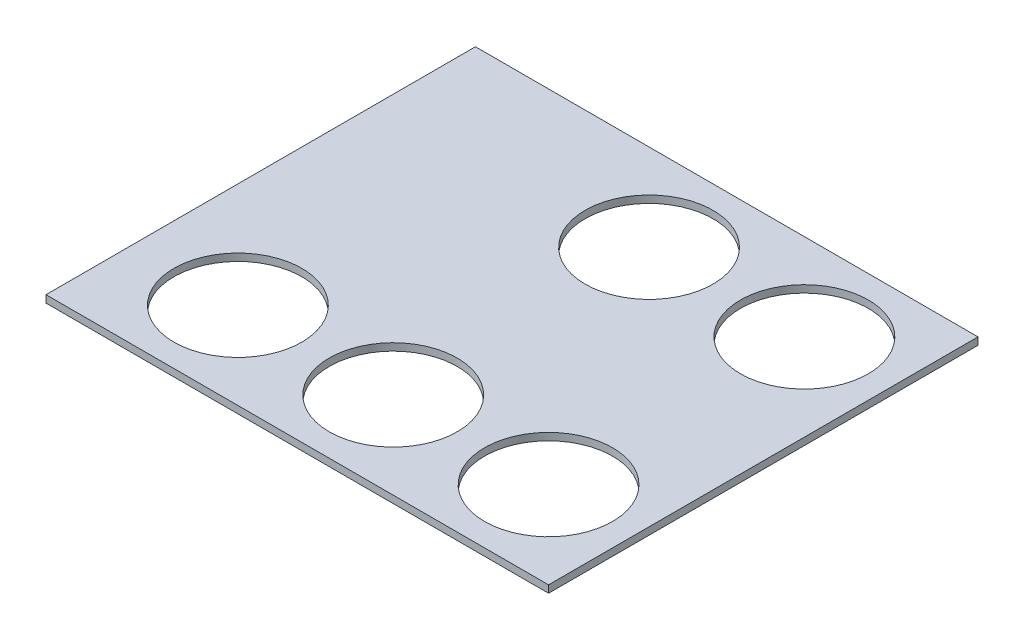
ISO-10303-21;
HEADER;
FILE_DESCRIPTION(('STEP AP214'),'2;1');
FILE_NAME('part.step','',(''),(''),'','','');
FILE_SCHEMA(('AUTOMOTIVE_DESIGN { 1 0 10303 214 1 1 1 1 }'));
ENDSEC;
DATA;
#1=APPLICATION_CONTEXT('core data for automotive mechanical design processes');
#2=APPLICATION_PROTOCOL_DEFINITION('international standard','automotive_design',2000,#1);
#3=PRODUCT_CONTEXT('',#1,'mechanical');
#4=PRODUCT('Part','Part','',(#3));
#5=PRODUCT_RELATED_PRODUCT_CATEGORY('part','',(#4));
#6=PRODUCT_DEFINITION_FORMATION('','',#4);
#7=PRODUCT_DEFINITION_CONTEXT('part definition',#1,'design');
#8=PRODUCT_DEFINITION('design','',#6,#7);
#9=PRODUCT_DEFINITION_SHAPE('','',#8);
#10=(LENGTH_UNIT() NAMED_UNIT(*) SI_UNIT(.MILLI.,.METRE.));
#11=(NAMED_UNIT(*) PLANE_ANGLE_UNIT() SI_UNIT($,.RADIAN.));
#12=(NAMED_UNIT(*) SI_UNIT($,.STERADIAN.) SOLID_ANGLE_UNIT());
#13=UNCERTAINTY_MEASURE_WITH_UNIT(LENGTH_MEASURE(1.E-05),#10,'distance_accuracy_value','');
#14=(GEOMETRIC_REPRESENTATION_CONTEXT(3) GLOBAL_UNCERTAINTY_ASSIGNED_CONTEXT((#13)) GLOBAL_UNIT_ASSIGNED_CONTEXT((#10,
#11,#12)) REPRESENTATION_CONTEXT('',''));
#15=CARTESIAN_POINT('',(0.,0.,0.));
#16=DIRECTION('',(0.,0.,1.));
#17=DIRECTION('',(1.,0.,0.));
#18=AXIS2_PLACEMENT_3D('',#15,#16,#17);
#19=CARTESIAN_POINT('',(0.,8.,0.));
#20=DIRECTION('',(1.,0.,0.));
#21=DIRECTION('',(0.,0.,-1.));
#22=AXIS2_PLACEMENT_3D('',#19,#20,#21);
#23=PLANE('',#22);
#24=DIRECTION('',(0.,0.,1.));
#25=VECTOR('',#24,1.);
#26=CARTESIAN_POINT('',(0.,0.,0.));
#27=LINE('',#26,#25);
#28=CARTESIAN_POINT('',(0.,0.,-470.));
#29=VERTEX_POINT('',#28);
#30=CARTESIAN_POINT('',(0.,0.,0.));
#31=VERTEX_POINT('',#30);
#32=EDGE_CURVE('E107',#29,#31,#27,.T.);
#33=ORIENTED_EDGE('',*,*,#32,.T.);
#34=DIRECTION('',(0.,-1.,0.));
#35=VECTOR('',#34,1.);
#36=CARTESIAN_POINT('',(0.,8.,0.));
#37=LINE('',#36,#35);
#38=CARTESIAN_POINT('',(0.,8.,0.));
#39=VERTEX_POINT('',#38);
#40=EDGE_CURVE('E11',#39,#31,#37,.T.);
#41=ORIENTED_EDGE('',*,*,#40,.F.);
#42=DIRECTION('',(0.,0.,1.));
#43=VECTOR('',#42,1.);
#44=CARTESIAN_POINT('',(0.,8.,0.));
#45=LINE('',#44,#43);
#46=CARTESIAN_POINT('',(0.,8.,-470.));
#47=VERTEX_POINT('',#46);
#48=EDGE_CURVE('E92',#47,#39,#45,.T.);
#49=ORIENTED_EDGE('',*,*,#48,.F.);
#50=DIRECTION('',(0.,-1.,0.));
#51=VECTOR('',#50,1.);
#52=CARTESIAN_POINT('',(0.,8.,-470.));
#53=LINE('',#52,#51);
#54=EDGE_CURVE('E103',#47,#29,#53,.T.);
#55=ORIENTED_EDGE('',*,*,#54,.T.);
#56=EDGE_LOOP('',(#33,#41,#49,#55));
#57=FACE_BOUND('',#56,.T.);
#58=ADVANCED_FACE('F38',(#57),#23,.F.);
#59=CARTESIAN_POINT('',(0.,8.,0.));
#60=DIRECTION('',(0.,0.,-1.));
#61=DIRECTION('',(-1.,0.,0.));
#62=AXIS2_PLACEMENT_3D('',#59,#60,#61);
#63=PLANE('',#62);
#64=DIRECTION('',(1.,0.,0.));
#65=VECTOR('',#64,1.);
#66=CARTESIAN_POINT('',(0.,0.,0.));
#67=LINE('',#66,#65);
#68=CARTESIAN_POINT('',(550.,0.,0.));
#69=VERTEX_POINT('',#68);
#70=EDGE_CURVE('E97',#31,#69,#67,.T.);
#71=ORIENTED_EDGE('',*,*,#70,.T.);
#72=DIRECTION('',(0.,-1.,0.));
#73=VECTOR('',#72,1.);
#74=CARTESIAN_POINT('',(550.,8.,0.));
#75=LINE('',#74,#73);
#76=CARTESIAN_POINT('',(550.,8.,0.));
#77=VERTEX_POINT('',#76);
#78=EDGE_CURVE('E47',#77,#69,#75,.T.);
#79=ORIENTED_EDGE('',*,*,#78,.F.);
#80=DIRECTION('',(1.,0.,0.));
#81=VECTOR('',#80,1.);
#82=CARTESIAN_POINT('',(0.,8.,0.));
#83=LINE('',#82,#81);
#84=EDGE_CURVE('E87',#39,#77,#83,.T.);
#85=ORIENTED_EDGE('',*,*,#84,.F.);
#86=ORIENTED_EDGE('',*,*,#40,.T.);
#87=EDGE_LOOP('',(#71,#79,#85,#86));
#88=FACE_BOUND('',#87,.T.);
#89=ADVANCED_FACE('F96',(#88),#63,.F.);
#90=CARTESIAN_POINT('',(550.,8.,0.));
#91=DIRECTION('',(-1.,0.,0.));
#92=DIRECTION('',(0.,0.,1.));
#93=AXIS2_PLACEMENT_3D('',#90,#91,#92);
#94=PLANE('',#93);
#95=DIRECTION('',(0.,0.,-1.));
#96=VECTOR('',#95,1.);
#97=CARTESIAN_POINT('',(550.,0.,0.));
#98=LINE('',#97,#96);
#99=CARTESIAN_POINT('',(550.,0.,-470.));
#100=VERTEX_POINT('',#99);
#101=EDGE_CURVE('E73',#69,#100,#98,.T.);
#102=ORIENTED_EDGE('',*,*,#101,.T.);
#103=DIRECTION('',(0.,-1.,0.));
#104=VECTOR('',#103,1.);
#105=CARTESIAN_POINT('',(550.,8.,-470.));
#106=LINE('',#105,#104);
#107=CARTESIAN_POINT('',(550.,8.,-470.));
#108=VERTEX_POINT('',#107);
#109=EDGE_CURVE('E98',#108,#100,#106,.T.);
#110=ORIENTED_EDGE('',*,*,#109,.F.);
#111=DIRECTION('',(0.,0.,-1.));
#112=VECTOR('',#111,1.);
#113=CARTESIAN_POINT('',(550.,8.,0.));
#114=LINE('',#113,#112);
#115=EDGE_CURVE('E90',#77,#108,#114,.T.);
#116=ORIENTED_EDGE('',*,*,#115,.F.);
#117=ORIENTED_EDGE('',*,*,#78,.T.);
#118=EDGE_LOOP('',(#102,#110,#116,#117));
#119=FACE_BOUND('',#118,.T.);
#120=ADVANCED_FACE('F99',(#119),#94,.F.);
#121=CARTESIAN_POINT('',(0.,8.,-470.));
#122=DIRECTION('',(0.,0.,1.));
#123=DIRECTION('',(1.,0.,0.));
#124=AXIS2_PLACEMENT_3D('',#121,#122,#123);
#125=PLANE('',#124);
#126=DIRECTION('',(-1.,0.,0.));
#127=VECTOR('',#126,1.);
#128=CARTESIAN_POINT('',(0.,0.,-470.));
#129=LINE('',#128,#127);
#130=EDGE_CURVE('E79',#100,#29,#129,.T.);
#131=ORIENTED_EDGE('',*,*,#130,.T.);
#132=ORIENTED_EDGE('',*,*,#54,.F.);
#133=DIRECTION('',(-1.,0.,0.));
#134=VECTOR('',#133,1.);
#135=CARTESIAN_POINT('',(0.,8.,-470.));
#136=LINE('',#135,#134);
#137=EDGE_CURVE('E55',#108,#47,#136,.T.);
#138=ORIENTED_EDGE('',*,*,#137,.F.);
#139=ORIENTED_EDGE('',*,*,#109,.T.);
#140=EDGE_LOOP('',(#131,#132,#138,#139));
#141=FACE_BOUND('',#140,.T.);
#142=ADVANCED_FACE('F117',(#141),#125,.F.);
#143=CARTESIAN_POINT('',(0.,8.,0.));
#144=DIRECTION('',(0.,-1.,0.));
#145=DIRECTION('',(0.,0.,-1.));
#146=AXIS2_PLACEMENT_3D('',#143,#144,#145);
#147=PLANE('',#146);
#148=CARTESIAN_POINT('',(285.,8.,-375.));
#149=DIRECTION('',(0.,1.,0.));
#150=DIRECTION('',(0.,0.,1.));
#151=AXIS2_PLACEMENT_3D('',#148,#149,#150);
#152=CIRCLE('',#151,70.);
#153=CARTESIAN_POINT('',(285.,8.,-305.));
#154=VERTEX_POINT('',#153);
#155=EDGE_CURVE('E137',#154,#154,#152,.T.);
#156=ORIENTED_EDGE('',*,*,#155,.F.);
#157=EDGE_LOOP('',(#156));
#158=FACE_BOUND('',#157,.T.);
#159=CARTESIAN_POINT('',(455.,8.,-375.));
#160=DIRECTION('',(0.,1.,0.));
#161=DIRECTION('',(0.,0.,1.));
#162=AXIS2_PLACEMENT_3D('',#159,#160,#161);
#163=CIRCLE('',#162,70.0000000000001);
#164=CARTESIAN_POINT('',(455.,8.,-305.));
#165=VERTEX_POINT('',#164);
#166=EDGE_CURVE('E145',#165,#165,#163,.T.);
#167=ORIENTED_EDGE('',*,*,#166,.F.);
#168=EDGE_LOOP('',(#167));
#169=FACE_BOUND('',#168,.T.);
#170=CARTESIAN_POINT('',(115.,8.,-95.));
#171=DIRECTION('',(0.,1.,0.));
#172=DIRECTION('',(0.,0.,1.));
#173=AXIS2_PLACEMENT_3D('',#170,#171,#172);
#174=CIRCLE('',#173,70.);
#175=CARTESIAN_POINT('',(115.,8.,-25.));
#176=VERTEX_POINT('',#175);
#177=EDGE_CURVE('E153',#176,#176,#174,.T.);
#178=ORIENTED_EDGE('',*,*,#177,.F.);
#179=EDGE_LOOP('',(#178));
#180=FACE_BOUND('',#179,.T.);
#181=CARTESIAN_POINT('',(285.,8.,-95.));
#182=DIRECTION('',(0.,1.,0.));
#183=DIRECTION('',(0.,0.,1.));
#184=AXIS2_PLACEMENT_3D('',#181,#182,#183);
#185=CIRCLE('',#184,70.);
#186=CARTESIAN_POINT('',(285.,8.,-25.));
#187=VERTEX_POINT('',#186);
#188=EDGE_CURVE('E129',#187,#187,#185,.T.);
#189=ORIENTED_EDGE('',*,*,#188,.F.);
#190=EDGE_LOOP('',(#189));
#191=FACE_BOUND('',#190,.T.);
#192=CARTESIAN_POINT('',(455.,8.,-95.));
#193=DIRECTION('',(0.,1.,0.));
#194=DIRECTION('',(0.,0.,1.));
#195=AXIS2_PLACEMENT_3D('',#192,#193,#194);
#196=CIRCLE('',#195,70.0000000000001);
#197=CARTESIAN_POINT('',(455.,8.,-24.9999999999999));
#198=VERTEX_POINT('',#197);
#199=EDGE_CURVE('E111',#198,#198,#196,.T.);
#200=ORIENTED_EDGE('',*,*,#199,.F.);
#201=EDGE_LOOP('',(#200));
#202=FACE_BOUND('',#201,.T.);
#203=ORIENTED_EDGE('',*,*,#48,.T.);
#204=ORIENTED_EDGE('',*,*,#84,.T.);
#205=ORIENTED_EDGE('',*,*,#115,.T.);
#206=ORIENTED_EDGE('',*,*,#137,.T.);
#207=EDGE_LOOP('',(#203,#204,#205,#206));
#208=FACE_BOUND('',#207,.T.);
#209=ADVANCED_FACE('F88',(#158,#169,#180,#191,#202,#208),#147,.F.);
#210=CARTESIAN_POINT('',(0.,0.,0.));
#211=DIRECTION('',(0.,-1.,0.));
#212=DIRECTION('',(0.,0.,-1.));
#213=AXIS2_PLACEMENT_3D('',#210,#211,#212);
#214=PLANE('',#213);
#215=CARTESIAN_POINT('',(285.,0.,-375.));
#216=DIRECTION('',(0.,1.,0.));
#217=DIRECTION('',(0.,0.,1.));
#218=AXIS2_PLACEMENT_3D('',#215,#216,#217);
#219=CIRCLE('',#218,70.);
#220=CARTESIAN_POINT('',(285.,0.,-305.));
#221=VERTEX_POINT('',#220);
#222=EDGE_CURVE('E133',#221,#221,#219,.T.);
#223=ORIENTED_EDGE('',*,*,#222,.T.);
#224=EDGE_LOOP('',(#223));
#225=FACE_BOUND('',#224,.T.);
#226=CARTESIAN_POINT('',(455.,0.,-375.));
#227=DIRECTION('',(0.,1.,0.));
#228=DIRECTION('',(0.,0.,1.));
#229=AXIS2_PLACEMENT_3D('',#226,#227,#228);
#230=CIRCLE('',#229,70.0000000000001);
#231=CARTESIAN_POINT('',(455.,0.,-305.));
#232=VERTEX_POINT('',#231);
#233=EDGE_CURVE('E141',#232,#232,#230,.T.);
#234=ORIENTED_EDGE('',*,*,#233,.T.);
#235=EDGE_LOOP('',(#234));
#236=FACE_BOUND('',#235,.T.);
#237=CARTESIAN_POINT('',(115.,0.,-95.));
#238=DIRECTION('',(0.,1.,0.));
#239=DIRECTION('',(0.,0.,1.));
#240=AXIS2_PLACEMENT_3D('',#237,#238,#239);
#241=CIRCLE('',#240,70.);
#242=CARTESIAN_POINT('',(115.,0.,-25.));
#243=VERTEX_POINT('',#242);
#244=EDGE_CURVE('E149',#243,#243,#241,.T.);
#245=ORIENTED_EDGE('',*,*,#244,.T.);
#246=EDGE_LOOP('',(#245));
#247=FACE_BOUND('',#246,.T.);
#248=CARTESIAN_POINT('',(285.,0.,-95.));
#249=DIRECTION('',(0.,1.,0.));
#250=DIRECTION('',(0.,0.,1.));
#251=AXIS2_PLACEMENT_3D('',#248,#249,#250);
#252=CIRCLE('',#251,70.);
#253=CARTESIAN_POINT('',(285.,0.,-25.));
#254=VERTEX_POINT('',#253);
#255=EDGE_CURVE('E157',#254,#254,#252,.T.);
#256=ORIENTED_EDGE('',*,*,#255,.T.);
#257=EDGE_LOOP('',(#256));
#258=FACE_BOUND('',#257,.T.);
#259=CARTESIAN_POINT('',(455.,0.,-95.));
#260=DIRECTION('',(0.,1.,0.));
#261=DIRECTION('',(0.,0.,1.));
#262=AXIS2_PLACEMENT_3D('',#259,#260,#261);
#263=CIRCLE('',#262,70.0000000000001);
#264=CARTESIAN_POINT('',(455.,0.,-24.9999999999999));
#265=VERTEX_POINT('',#264);
#266=EDGE_CURVE('E125',#265,#265,#263,.T.);
#267=ORIENTED_EDGE('',*,*,#266,.T.);
#268=EDGE_LOOP('',(#267));
#269=FACE_BOUND('',#268,.T.);
#270=ORIENTED_EDGE('',*,*,#32,.F.);
#271=ORIENTED_EDGE('',*,*,#130,.F.);
#272=ORIENTED_EDGE('',*,*,#101,.F.);
#273=ORIENTED_EDGE('',*,*,#70,.F.);
#274=EDGE_LOOP('',(#270,#271,#272,#273));
#275=FACE_BOUND('',#274,.T.);
#276=ADVANCED_FACE('F120',(#225,#236,#247,#258,#269,#275),#214,.T.);
#277=CARTESIAN_POINT('',(455.,8.,-95.));
#278=DIRECTION('',(0.,-1.,0.));
#279=DIRECTION('',(0.,0.,-1.));
#280=AXIS2_PLACEMENT_3D('',#277,#278,#279);
#281=CYLINDRICAL_SURFACE('',#280,70.0000000000001);
#282=ORIENTED_EDGE('',*,*,#199,.T.);
#283=EDGE_LOOP('',(#282));
#284=FACE_BOUND('',#283,.T.);
#285=ORIENTED_EDGE('',*,*,#266,.F.);
#286=EDGE_LOOP('',(#285));
#287=FACE_BOUND('',#286,.T.);
#288=ADVANCED_FACE('F173',(#284,#287),#281,.F.);
#289=CARTESIAN_POINT('',(285.,8.,-95.));
#290=DIRECTION('',(0.,-1.,0.));
#291=DIRECTION('',(0.,0.,-1.));
#292=AXIS2_PLACEMENT_3D('',#289,#290,#291);
#293=CYLINDRICAL_SURFACE('',#292,70.);
#294=ORIENTED_EDGE('',*,*,#188,.T.);
#295=EDGE_LOOP('',(#294));
#296=FACE_BOUND('',#295,.T.);
#297=ORIENTED_EDGE('',*,*,#255,.F.);
#298=EDGE_LOOP('',(#297));
#299=FACE_BOUND('',#298,.T.);
#300=ADVANCED_FACE('F164',(#296,#299),#293,.F.);
#301=CARTESIAN_POINT('',(115.,8.,-95.));
#302=DIRECTION('',(0.,-1.,0.));
#303=DIRECTION('',(0.,0.,-1.));
#304=AXIS2_PLACEMENT_3D('',#301,#302,#303);
#305=CYLINDRICAL_SURFACE('',#304,70.);
#306=ORIENTED_EDGE('',*,*,#177,.T.);
#307=EDGE_LOOP('',(#306));
#308=FACE_BOUND('',#307,.T.);
#309=ORIENTED_EDGE('',*,*,#244,.F.);
#310=EDGE_LOOP('',(#309));
#311=FACE_BOUND('',#310,.T.);
#312=ADVANCED_FACE('F217',(#308,#311),#305,.F.);
#313=CARTESIAN_POINT('',(455.,8.,-375.));
#314=DIRECTION('',(0.,-1.,0.));
#315=DIRECTION('',(0.,0.,-1.));
#316=AXIS2_PLACEMENT_3D('',#313,#314,#315);
#317=CYLINDRICAL_SURFACE('',#316,70.0000000000001);
#318=ORIENTED_EDGE('',*,*,#166,.T.);
#319=EDGE_LOOP('',(#318));
#320=FACE_BOUND('',#319,.T.);
#321=ORIENTED_EDGE('',*,*,#233,.F.);
#322=EDGE_LOOP('',(#321));
#323=FACE_BOUND('',#322,.T.);
#324=ADVANCED_FACE('F224',(#320,#323),#317,.F.);
#325=CARTESIAN_POINT('',(285.,8.,-375.));
#326=DIRECTION('',(0.,-1.,0.));
#327=DIRECTION('',(0.,0.,-1.));
#328=AXIS2_PLACEMENT_3D('',#325,#326,#327);
#329=CYLINDRICAL_SURFACE('',#328,70.);
#330=ORIENTED_EDGE('',*,*,#155,.T.);
#331=EDGE_LOOP('',(#330));
#332=FACE_BOUND('',#331,.T.);
#333=ORIENTED_EDGE('',*,*,#222,.F.);
#334=EDGE_LOOP('',(#333));
#335=FACE_BOUND('',#334,.T.);
#336=ADVANCED_FACE('F232',(#332,#335),#329,.F.);
#337=CLOSED_SHELL('',(#58,#89,#120,#142,#209,#276,#288,#300,#312,#324,#336));
#338=MANIFOLD_SOLID_BREP('B2',#337);
#339=ADVANCED_BREP_SHAPE_REPRESENTATION('',(#18,#338),#14);
#340=SHAPE_DEFINITION_REPRESENTATION(#9,#339);
ENDSEC;
END-ISO-10303-21;
